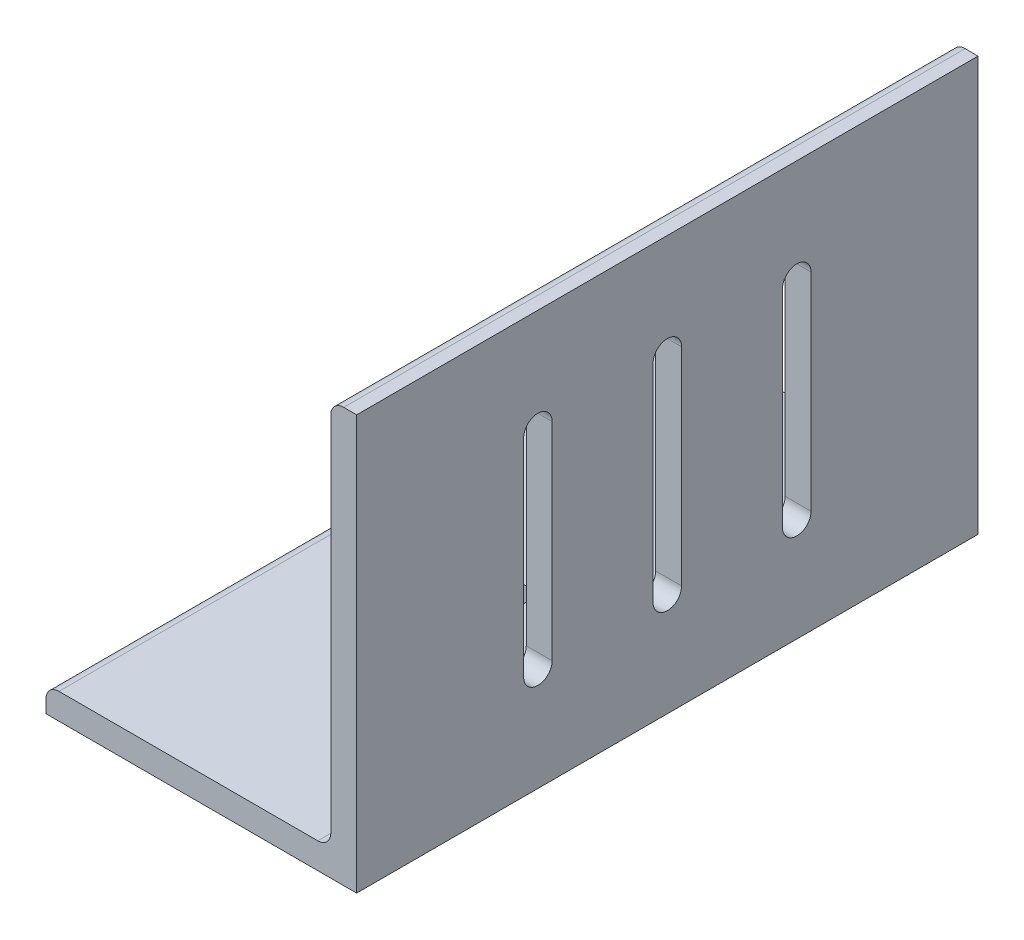
ISO-10303-21;
HEADER;
FILE_DESCRIPTION(('STEP AP214'),'2;1');
FILE_NAME('part.step','',(''),(''),'','','');
FILE_SCHEMA(('AUTOMOTIVE_DESIGN { 1 0 10303 214 1 1 1 1 }'));
ENDSEC;
DATA;
#1=APPLICATION_CONTEXT('core data for automotive mechanical design processes');
#2=APPLICATION_PROTOCOL_DEFINITION('international standard','automotive_design',2000,#1);
#3=PRODUCT_CONTEXT('',#1,'mechanical');
#4=PRODUCT('Part','Part','',(#3));
#5=PRODUCT_RELATED_PRODUCT_CATEGORY('part','',(#4));
#6=PRODUCT_DEFINITION_FORMATION('','',#4);
#7=PRODUCT_DEFINITION_CONTEXT('part definition',#1,'design');
#8=PRODUCT_DEFINITION('design','',#6,#7);
#9=PRODUCT_DEFINITION_SHAPE('','',#8);
#10=(LENGTH_UNIT() NAMED_UNIT(*) SI_UNIT(.MILLI.,.METRE.));
#11=(NAMED_UNIT(*) PLANE_ANGLE_UNIT() SI_UNIT($,.RADIAN.));
#12=(NAMED_UNIT(*) SI_UNIT($,.STERADIAN.) SOLID_ANGLE_UNIT());
#13=UNCERTAINTY_MEASURE_WITH_UNIT(LENGTH_MEASURE(1.E-05),#10,'distance_accuracy_value','');
#14=(GEOMETRIC_REPRESENTATION_CONTEXT(3) GLOBAL_UNCERTAINTY_ASSIGNED_CONTEXT((#13)) GLOBAL_UNIT_ASSIGNED_CONTEXT((#10,
#11,#12)) REPRESENTATION_CONTEXT('',''));
#15=CARTESIAN_POINT('',(0.,0.,0.));
#16=DIRECTION('',(0.,0.,1.));
#17=DIRECTION('',(1.,0.,0.));
#18=AXIS2_PLACEMENT_3D('',#15,#16,#17);
#19=CARTESIAN_POINT('',(-38.1,3.175,76.2));
#20=DIRECTION('',(1.,0.,0.));
#21=DIRECTION('',(0.,0.,-1.));
#22=AXIS2_PLACEMENT_3D('',#19,#20,#21);
#23=PLANE('',#22);
#24=DIRECTION('',(0.,-1.,0.));
#25=VECTOR('',#24,1.);
#26=CARTESIAN_POINT('',(-38.1,3.175,-76.2));
#27=LINE('',#26,#25);
#28=CARTESIAN_POINT('',(-38.1,3.175,-76.2));
#29=VERTEX_POINT('',#28);
#30=CARTESIAN_POINT('',(-38.1,0.,-76.2));
#31=VERTEX_POINT('',#30);
#32=EDGE_CURVE('E222',#29,#31,#27,.T.);
#33=ORIENTED_EDGE('',*,*,#32,.T.);
#34=DIRECTION('',(0.,0.,-1.));
#35=VECTOR('',#34,1.);
#36=CARTESIAN_POINT('',(-38.1,0.,76.2));
#37=LINE('',#36,#35);
#38=CARTESIAN_POINT('',(-38.1,0.,76.2));
#39=VERTEX_POINT('',#38);
#40=EDGE_CURVE('E368',#39,#31,#37,.T.);
#41=ORIENTED_EDGE('',*,*,#40,.F.);
#42=DIRECTION('',(0.,-1.,0.));
#43=VECTOR('',#42,1.);
#44=CARTESIAN_POINT('',(-38.1,3.175,76.2));
#45=LINE('',#44,#43);
#46=CARTESIAN_POINT('',(-38.1,3.175,76.2));
#47=VERTEX_POINT('',#46);
#48=EDGE_CURVE('E281',#47,#39,#45,.T.);
#49=ORIENTED_EDGE('',*,*,#48,.F.);
#50=DIRECTION('',(0.,0.,-1.));
#51=VECTOR('',#50,1.);
#52=CARTESIAN_POINT('',(-38.1,3.175,76.2));
#53=LINE('',#52,#51);
#54=EDGE_CURVE('E310',#47,#29,#53,.T.);
#55=ORIENTED_EDGE('',*,*,#54,.T.);
#56=EDGE_LOOP('',(#33,#41,#49,#55));
#57=FACE_BOUND('',#56,.T.);
#58=ADVANCED_FACE('F41',(#57),#23,.F.);
#59=CARTESIAN_POINT('',(-38.1,0.,76.2));
#60=DIRECTION('',(0.,1.,0.));
#61=DIRECTION('',(0.,0.,1.));
#62=AXIS2_PLACEMENT_3D('',#59,#60,#61);
#63=PLANE('',#62);
#64=CARTESIAN_POINT('',(2.67147415300428E-13,0.,-25.4));
#65=DIRECTION('',(0.,-1.,0.));
#66=DIRECTION('',(0.,0.,1.));
#67=AXIS2_PLACEMENT_3D('',#64,#65,#66);
#68=CIRCLE('',#67,3.5);
#69=CARTESIAN_POINT('',(2.67147415300428E-13,0.,-21.9));
#70=VERTEX_POINT('',#69);
#71=EDGE_CURVE('E567',#70,#70,#68,.T.);
#72=ORIENTED_EDGE('',*,*,#71,.F.);
#73=EDGE_LOOP('',(#72));
#74=FACE_BOUND('',#73,.T.);
#75=CARTESIAN_POINT('',(-2.67147415300428E-13,0.,25.4));
#76=DIRECTION('',(0.,-1.,0.));
#77=DIRECTION('',(0.,0.,-1.));
#78=AXIS2_PLACEMENT_3D('',#75,#76,#77);
#79=CIRCLE('',#78,3.5);
#80=CARTESIAN_POINT('',(-2.67147415300428E-13,0.,21.9));
#81=VERTEX_POINT('',#80);
#82=EDGE_CURVE('E563',#81,#81,#79,.T.);
#83=ORIENTED_EDGE('',*,*,#82,.F.);
#84=EDGE_LOOP('',(#83));
#85=FACE_BOUND('',#84,.T.);
#86=CARTESIAN_POINT('',(0.,0.,0.));
#87=DIRECTION('',(0.,-1.,0.));
#88=DIRECTION('',(0.,0.,-1.));
#89=AXIS2_PLACEMENT_3D('',#86,#87,#88);
#90=CIRCLE('',#89,3.5);
#91=CARTESIAN_POINT('',(0.,0.,-3.50000000000003));
#92=VERTEX_POINT('',#91);
#93=EDGE_CURVE('E416',#92,#92,#90,.T.);
#94=ORIENTED_EDGE('',*,*,#93,.F.);
#95=EDGE_LOOP('',(#94));
#96=FACE_BOUND('',#95,.T.);
#97=DIRECTION('',(1.,0.,0.));
#98=VECTOR('',#97,1.);
#99=CARTESIAN_POINT('',(-38.1,0.,-76.2));
#100=LINE('',#99,#98);
#101=CARTESIAN_POINT('',(38.1,0.,-76.2));
#102=VERTEX_POINT('',#101);
#103=EDGE_CURVE('E314',#31,#102,#100,.T.);
#104=ORIENTED_EDGE('',*,*,#103,.T.);
#105=DIRECTION('',(0.,0.,-1.));
#106=VECTOR('',#105,1.);
#107=CARTESIAN_POINT('',(38.1,0.,76.2));
#108=LINE('',#107,#106);
#109=CARTESIAN_POINT('',(38.1,0.,76.2));
#110=VERTEX_POINT('',#109);
#111=EDGE_CURVE('E364',#110,#102,#108,.T.);
#112=ORIENTED_EDGE('',*,*,#111,.F.);
#113=DIRECTION('',(1.,0.,0.));
#114=VECTOR('',#113,1.);
#115=CARTESIAN_POINT('',(-38.1,0.,76.2));
#116=LINE('',#115,#114);
#117=EDGE_CURVE('E285',#39,#110,#116,.T.);
#118=ORIENTED_EDGE('',*,*,#117,.F.);
#119=ORIENTED_EDGE('',*,*,#40,.T.);
#120=EDGE_LOOP('',(#104,#112,#118,#119));
#121=FACE_BOUND('',#120,.T.);
#122=ADVANCED_FACE('F441',(#74,#85,#96,#121),#63,.F.);
#123=CARTESIAN_POINT('',(38.1,0.,76.2));
#124=DIRECTION('',(-1.,0.,0.));
#125=DIRECTION('',(0.,-1.,0.));
#126=AXIS2_PLACEMENT_3D('',#123,#124,#125);
#127=PLANE('',#126);
#128=DIRECTION('',(0.,-1.,0.));
#129=VECTOR('',#128,1.);
#130=CARTESIAN_POINT('',(38.1,76.2,35.25));
#131=LINE('',#130,#129);
#132=CARTESIAN_POINT('',(38.1,76.2,35.25));
#133=VERTEX_POINT('',#132);
#134=CARTESIAN_POINT('',(38.1,25.4,35.25));
#135=VERTEX_POINT('',#134);
#136=EDGE_CURVE('E204',#133,#135,#131,.T.);
#137=ORIENTED_EDGE('',*,*,#136,.F.);
#138=CARTESIAN_POINT('',(38.1,76.2,31.75));
#139=DIRECTION('',(1.,0.,0.));
#140=DIRECTION('',(0.,1.,0.));
#141=AXIS2_PLACEMENT_3D('',#138,#139,#140);
#142=CIRCLE('',#141,3.5);
#143=CARTESIAN_POINT('',(38.1,76.2,28.25));
#144=VERTEX_POINT('',#143);
#145=EDGE_CURVE('E58',#144,#133,#142,.T.);
#146=ORIENTED_EDGE('',*,*,#145,.F.);
#147=DIRECTION('',(0.,1.,0.));
#148=VECTOR('',#147,1.);
#149=CARTESIAN_POINT('',(38.1,76.2,28.25));
#150=LINE('',#149,#148);
#151=CARTESIAN_POINT('',(38.1,25.4,28.25));
#152=VERTEX_POINT('',#151);
#153=EDGE_CURVE('E212',#152,#144,#150,.T.);
#154=ORIENTED_EDGE('',*,*,#153,.F.);
#155=CARTESIAN_POINT('',(38.1,25.4,31.75));
#156=DIRECTION('',(1.,0.,0.));
#157=DIRECTION('',(0.,1.,0.));
#158=AXIS2_PLACEMENT_3D('',#155,#156,#157);
#159=CIRCLE('',#158,3.5);
#160=EDGE_CURVE('E193',#135,#152,#159,.T.);
#161=ORIENTED_EDGE('',*,*,#160,.F.);
#162=EDGE_LOOP('',(#137,#146,#154,#161));
#163=FACE_BOUND('',#162,.T.);
#164=DIRECTION('',(0.,-1.,0.));
#165=VECTOR('',#164,1.);
#166=CARTESIAN_POINT('',(38.1,76.2,-28.25));
#167=LINE('',#166,#165);
#168=CARTESIAN_POINT('',(38.1,76.2,-28.25));
#169=VERTEX_POINT('',#168);
#170=CARTESIAN_POINT('',(38.1,25.4,-28.25));
#171=VERTEX_POINT('',#170);
#172=EDGE_CURVE('E229',#169,#171,#167,.T.);
#173=ORIENTED_EDGE('',*,*,#172,.F.);
#174=CARTESIAN_POINT('',(38.1,76.2,-31.75));
#175=DIRECTION('',(1.,0.,0.));
#176=DIRECTION('',(0.,-1.,0.));
#177=AXIS2_PLACEMENT_3D('',#174,#175,#176);
#178=CIRCLE('',#177,3.5);
#179=CARTESIAN_POINT('',(38.1,76.2,-35.25));
#180=VERTEX_POINT('',#179);
#181=EDGE_CURVE('E66',#180,#169,#178,.T.);
#182=ORIENTED_EDGE('',*,*,#181,.F.);
#183=DIRECTION('',(0.,1.,0.));
#184=VECTOR('',#183,1.);
#185=CARTESIAN_POINT('',(38.1,76.2,-35.25));
#186=LINE('',#185,#184);
#187=CARTESIAN_POINT('',(38.1,25.4,-35.25));
#188=VERTEX_POINT('',#187);
#189=EDGE_CURVE('E238',#188,#180,#186,.T.);
#190=ORIENTED_EDGE('',*,*,#189,.F.);
#191=CARTESIAN_POINT('',(38.1,25.4,-31.75));
#192=DIRECTION('',(1.,0.,0.));
#193=DIRECTION('',(0.,-1.,0.));
#194=AXIS2_PLACEMENT_3D('',#191,#192,#193);
#195=CIRCLE('',#194,3.5);
#196=EDGE_CURVE('E234',#171,#188,#195,.T.);
#197=ORIENTED_EDGE('',*,*,#196,.F.);
#198=EDGE_LOOP('',(#173,#182,#190,#197));
#199=FACE_BOUND('',#198,.T.);
#200=DIRECTION('',(0.,-1.,0.));
#201=VECTOR('',#200,1.);
#202=CARTESIAN_POINT('',(38.1,76.2,3.5));
#203=LINE('',#202,#201);
#204=CARTESIAN_POINT('',(38.1,76.2,3.50000000000001));
#205=VERTEX_POINT('',#204);
#206=CARTESIAN_POINT('',(38.1,25.4,3.50000000000001));
#207=VERTEX_POINT('',#206);
#208=EDGE_CURVE('E257',#205,#207,#203,.T.);
#209=ORIENTED_EDGE('',*,*,#208,.F.);
#210=CARTESIAN_POINT('',(38.1,76.2,0.));
#211=DIRECTION('',(1.,0.,0.));
#212=DIRECTION('',(0.,1.,0.));
#213=AXIS2_PLACEMENT_3D('',#210,#211,#212);
#214=CIRCLE('',#213,3.5);
#215=CARTESIAN_POINT('',(38.1,76.2,-3.5));
#216=VERTEX_POINT('',#215);
#217=EDGE_CURVE('E254',#216,#205,#214,.T.);
#218=ORIENTED_EDGE('',*,*,#217,.F.);
#219=DIRECTION('',(0.,1.,0.));
#220=VECTOR('',#219,1.);
#221=CARTESIAN_POINT('',(38.1,76.2,-3.5));
#222=LINE('',#221,#220);
#223=CARTESIAN_POINT('',(38.1,25.4,-3.5));
#224=VERTEX_POINT('',#223);
#225=EDGE_CURVE('E265',#224,#216,#222,.T.);
#226=ORIENTED_EDGE('',*,*,#225,.F.);
#227=CARTESIAN_POINT('',(38.1,25.4,0.));
#228=DIRECTION('',(1.,0.,0.));
#229=DIRECTION('',(0.,1.,0.));
#230=AXIS2_PLACEMENT_3D('',#227,#228,#229);
#231=CIRCLE('',#230,3.5);
#232=EDGE_CURVE('E261',#207,#224,#231,.T.);
#233=ORIENTED_EDGE('',*,*,#232,.F.);
#234=EDGE_LOOP('',(#209,#218,#226,#233));
#235=FACE_BOUND('',#234,.T.);
#236=DIRECTION('',(0.,1.,0.));
#237=VECTOR('',#236,1.);
#238=CARTESIAN_POINT('',(38.1,0.,-76.2));
#239=LINE('',#238,#237);
#240=CARTESIAN_POINT('',(38.1,101.6,-76.2));
#241=VERTEX_POINT('',#240);
#242=EDGE_CURVE('E317',#102,#241,#239,.T.);
#243=ORIENTED_EDGE('',*,*,#242,.T.);
#244=DIRECTION('',(0.,0.,-1.));
#245=VECTOR('',#244,1.);
#246=CARTESIAN_POINT('',(38.1,101.6,76.2));
#247=LINE('',#246,#245);
#248=CARTESIAN_POINT('',(38.1,101.6,76.2));
#249=VERTEX_POINT('',#248);
#250=EDGE_CURVE('E360',#249,#241,#247,.T.);
#251=ORIENTED_EDGE('',*,*,#250,.F.);
#252=DIRECTION('',(0.,1.,0.));
#253=VECTOR('',#252,1.);
#254=CARTESIAN_POINT('',(38.1,0.,76.2));
#255=LINE('',#254,#253);
#256=EDGE_CURVE('E289',#110,#249,#255,.T.);
#257=ORIENTED_EDGE('',*,*,#256,.F.);
#258=ORIENTED_EDGE('',*,*,#111,.T.);
#259=EDGE_LOOP('',(#243,#251,#257,#258));
#260=FACE_BOUND('',#259,.T.);
#261=ADVANCED_FACE('F209',(#163,#199,#235,#260),#127,.F.);
#262=CARTESIAN_POINT('',(34.925,101.6,76.2));
#263=DIRECTION('',(0.,-1.,0.));
#264=DIRECTION('',(1.,0.,0.));
#265=AXIS2_PLACEMENT_3D('',#262,#263,#264);
#266=PLANE('',#265);
#267=DIRECTION('',(-1.,0.,0.));
#268=VECTOR('',#267,1.);
#269=CARTESIAN_POINT('',(34.925,101.6,-76.2));
#270=LINE('',#269,#268);
#271=CARTESIAN_POINT('',(34.925,101.6,-76.2));
#272=VERTEX_POINT('',#271);
#273=EDGE_CURVE('E320',#241,#272,#270,.T.);
#274=ORIENTED_EDGE('',*,*,#273,.T.);
#275=DIRECTION('',(0.,0.,-1.));
#276=VECTOR('',#275,1.);
#277=CARTESIAN_POINT('',(34.925,101.6,76.2));
#278=LINE('',#277,#276);
#279=CARTESIAN_POINT('',(34.925,101.6,76.2));
#280=VERTEX_POINT('',#279);
#281=EDGE_CURVE('E356',#280,#272,#278,.T.);
#282=ORIENTED_EDGE('',*,*,#281,.F.);
#283=DIRECTION('',(-1.,0.,0.));
#284=VECTOR('',#283,1.);
#285=CARTESIAN_POINT('',(34.925,101.6,76.2));
#286=LINE('',#285,#284);
#287=EDGE_CURVE('E292',#249,#280,#286,.T.);
#288=ORIENTED_EDGE('',*,*,#287,.F.);
#289=ORIENTED_EDGE('',*,*,#250,.T.);
#290=EDGE_LOOP('',(#274,#282,#288,#289));
#291=FACE_BOUND('',#290,.T.);
#292=ADVANCED_FACE('F485',(#291),#266,.F.);
#293=CARTESIAN_POINT('',(34.925,98.425,76.2));
#294=DIRECTION('',(0.,0.,-1.));
#295=DIRECTION('',(-1.,0.,0.));
#296=AXIS2_PLACEMENT_3D('',#293,#294,#295);
#297=CYLINDRICAL_SURFACE('',#296,3.175);
#298=CARTESIAN_POINT('',(34.925,98.425,-76.2));
#299=DIRECTION('',(0.,0.,1.));
#300=DIRECTION('',(-1.,0.,0.));
#301=AXIS2_PLACEMENT_3D('',#298,#299,#300);
#302=CIRCLE('',#301,3.175);
#303=CARTESIAN_POINT('',(31.75,98.425,-76.2));
#304=VERTEX_POINT('',#303);
#305=EDGE_CURVE('E323',#272,#304,#302,.T.);
#306=ORIENTED_EDGE('',*,*,#305,.T.);
#307=DIRECTION('',(0.,0.,-1.));
#308=VECTOR('',#307,1.);
#309=CARTESIAN_POINT('',(31.75,98.425,76.2));
#310=LINE('',#309,#308);
#311=CARTESIAN_POINT('',(31.75,98.425,76.2));
#312=VERTEX_POINT('',#311);
#313=EDGE_CURVE('E352',#312,#304,#310,.T.);
#314=ORIENTED_EDGE('',*,*,#313,.F.);
#315=CARTESIAN_POINT('',(34.925,98.425,76.2));
#316=DIRECTION('',(0.,0.,1.));
#317=DIRECTION('',(-1.,0.,0.));
#318=AXIS2_PLACEMENT_3D('',#315,#316,#317);
#319=CIRCLE('',#318,3.175);
#320=EDGE_CURVE('E295',#280,#312,#319,.T.);
#321=ORIENTED_EDGE('',*,*,#320,.F.);
#322=ORIENTED_EDGE('',*,*,#281,.T.);
#323=EDGE_LOOP('',(#306,#314,#321,#322));
#324=FACE_BOUND('',#323,.T.);
#325=ADVANCED_FACE('F482',(#324),#297,.T.);
#326=CARTESIAN_POINT('',(31.75,98.425,76.2));
#327=DIRECTION('',(1.,0.,0.));
#328=DIRECTION('',(0.,1.,0.));
#329=AXIS2_PLACEMENT_3D('',#326,#327,#328);
#330=PLANE('',#329);
#331=DIRECTION('',(0.,1.,0.));
#332=VECTOR('',#331,1.);
#333=CARTESIAN_POINT('',(31.75,98.425,28.25));
#334=LINE('',#333,#332);
#335=CARTESIAN_POINT('',(31.75,25.4,28.25));
#336=VERTEX_POINT('',#335);
#337=CARTESIAN_POINT('',(31.75,76.2,28.25));
#338=VERTEX_POINT('',#337);
#339=EDGE_CURVE('E50',#336,#338,#334,.T.);
#340=ORIENTED_EDGE('',*,*,#339,.T.);
#341=CARTESIAN_POINT('',(31.75,76.2,31.75));
#342=DIRECTION('',(1.,0.,0.));
#343=DIRECTION('',(0.,1.,0.));
#344=AXIS2_PLACEMENT_3D('',#341,#342,#343);
#345=CIRCLE('',#344,3.5);
#346=CARTESIAN_POINT('',(31.75,76.2,35.25));
#347=VERTEX_POINT('',#346);
#348=EDGE_CURVE('E11',#338,#347,#345,.T.);
#349=ORIENTED_EDGE('',*,*,#348,.T.);
#350=DIRECTION('',(0.,-1.,0.));
#351=VECTOR('',#350,1.);
#352=CARTESIAN_POINT('',(31.75,98.425,35.25));
#353=LINE('',#352,#351);
#354=CARTESIAN_POINT('',(31.75,25.4,35.25));
#355=VERTEX_POINT('',#354);
#356=EDGE_CURVE('E404',#347,#355,#353,.T.);
#357=ORIENTED_EDGE('',*,*,#356,.T.);
#358=CARTESIAN_POINT('',(31.75,25.4,31.75));
#359=DIRECTION('',(1.,0.,0.));
#360=DIRECTION('',(0.,1.,0.));
#361=AXIS2_PLACEMENT_3D('',#358,#359,#360);
#362=CIRCLE('',#361,3.5);
#363=EDGE_CURVE('E196',#355,#336,#362,.T.);
#364=ORIENTED_EDGE('',*,*,#363,.T.);
#365=EDGE_LOOP('',(#340,#349,#357,#364));
#366=FACE_BOUND('',#365,.T.);
#367=DIRECTION('',(0.,1.,0.));
#368=VECTOR('',#367,1.);
#369=CARTESIAN_POINT('',(31.75,98.425,-35.25));
#370=LINE('',#369,#368);
#371=CARTESIAN_POINT('',(31.75,25.4,-35.25));
#372=VERTEX_POINT('',#371);
#373=CARTESIAN_POINT('',(31.75,76.2,-35.25));
#374=VERTEX_POINT('',#373);
#375=EDGE_CURVE('E396',#372,#374,#370,.T.);
#376=ORIENTED_EDGE('',*,*,#375,.T.);
#377=CARTESIAN_POINT('',(31.75,76.2,-31.75));
#378=DIRECTION('',(1.,0.,0.));
#379=DIRECTION('',(0.,1.,0.));
#380=AXIS2_PLACEMENT_3D('',#377,#378,#379);
#381=CIRCLE('',#380,3.5);
#382=CARTESIAN_POINT('',(31.75,76.2,-28.25));
#383=VERTEX_POINT('',#382);
#384=EDGE_CURVE('E400',#374,#383,#381,.T.);
#385=ORIENTED_EDGE('',*,*,#384,.T.);
#386=DIRECTION('',(0.,-1.,0.));
#387=VECTOR('',#386,1.);
#388=CARTESIAN_POINT('',(31.75,98.425,-28.25));
#389=LINE('',#388,#387);
#390=CARTESIAN_POINT('',(31.75,25.4,-28.25));
#391=VERTEX_POINT('',#390);
#392=EDGE_CURVE('E388',#383,#391,#389,.T.);
#393=ORIENTED_EDGE('',*,*,#392,.T.);
#394=CARTESIAN_POINT('',(31.75,25.4,-31.75));
#395=DIRECTION('',(1.,0.,0.));
#396=DIRECTION('',(0.,1.,0.));
#397=AXIS2_PLACEMENT_3D('',#394,#395,#396);
#398=CIRCLE('',#397,3.5);
#399=EDGE_CURVE('E392',#391,#372,#398,.T.);
#400=ORIENTED_EDGE('',*,*,#399,.T.);
#401=EDGE_LOOP('',(#376,#385,#393,#400));
#402=FACE_BOUND('',#401,.T.);
#403=DIRECTION('',(0.,1.,0.));
#404=VECTOR('',#403,1.);
#405=CARTESIAN_POINT('',(31.75,98.425,-3.5));
#406=LINE('',#405,#404);
#407=CARTESIAN_POINT('',(31.75,25.4,-3.5));
#408=VERTEX_POINT('',#407);
#409=CARTESIAN_POINT('',(31.75,76.2,-3.5));
#410=VERTEX_POINT('',#409);
#411=EDGE_CURVE('E380',#408,#410,#406,.T.);
#412=ORIENTED_EDGE('',*,*,#411,.T.);
#413=CARTESIAN_POINT('',(31.75,76.2,0.));
#414=DIRECTION('',(1.,0.,0.));
#415=DIRECTION('',(0.,1.,0.));
#416=AXIS2_PLACEMENT_3D('',#413,#414,#415);
#417=CIRCLE('',#416,3.5);
#418=CARTESIAN_POINT('',(31.75,76.2,3.5));
#419=VERTEX_POINT('',#418);
#420=EDGE_CURVE('E384',#410,#419,#417,.T.);
#421=ORIENTED_EDGE('',*,*,#420,.T.);
#422=DIRECTION('',(0.,-1.,0.));
#423=VECTOR('',#422,1.);
#424=CARTESIAN_POINT('',(31.75,98.425,3.5));
#425=LINE('',#424,#423);
#426=CARTESIAN_POINT('',(31.75,25.4,3.5));
#427=VERTEX_POINT('',#426);
#428=EDGE_CURVE('E372',#419,#427,#425,.T.);
#429=ORIENTED_EDGE('',*,*,#428,.T.);
#430=CARTESIAN_POINT('',(31.75,25.4,0.));
#431=DIRECTION('',(1.,0.,0.));
#432=DIRECTION('',(0.,1.,0.));
#433=AXIS2_PLACEMENT_3D('',#430,#431,#432);
#434=CIRCLE('',#433,3.5);
#435=EDGE_CURVE('E376',#427,#408,#434,.T.);
#436=ORIENTED_EDGE('',*,*,#435,.T.);
#437=EDGE_LOOP('',(#412,#421,#429,#436));
#438=FACE_BOUND('',#437,.T.);
#439=DIRECTION('',(0.,-1.,0.));
#440=VECTOR('',#439,1.);
#441=CARTESIAN_POINT('',(31.75,98.425,-76.2));
#442=LINE('',#441,#440);
#443=CARTESIAN_POINT('',(31.75,9.52499999999999,-76.2));
#444=VERTEX_POINT('',#443);
#445=EDGE_CURVE('E326',#304,#444,#442,.T.);
#446=ORIENTED_EDGE('',*,*,#445,.T.);
#447=DIRECTION('',(0.,0.,-1.));
#448=VECTOR('',#447,1.);
#449=CARTESIAN_POINT('',(31.75,9.52499999999999,76.2));
#450=LINE('',#449,#448);
#451=CARTESIAN_POINT('',(31.75,9.52499999999999,76.2));
#452=VERTEX_POINT('',#451);
#453=EDGE_CURVE('E348',#452,#444,#450,.T.);
#454=ORIENTED_EDGE('',*,*,#453,.F.);
#455=DIRECTION('',(0.,-1.,0.));
#456=VECTOR('',#455,1.);
#457=CARTESIAN_POINT('',(31.75,98.425,76.2));
#458=LINE('',#457,#456);
#459=EDGE_CURVE('E298',#312,#452,#458,.T.);
#460=ORIENTED_EDGE('',*,*,#459,.F.);
#461=ORIENTED_EDGE('',*,*,#313,.T.);
#462=EDGE_LOOP('',(#446,#454,#460,#461));
#463=FACE_BOUND('',#462,.T.);
#464=ADVANCED_FACE('F478',(#366,#402,#438,#463),#330,.F.);
#465=CARTESIAN_POINT('',(28.575,9.52499999999999,76.2));
#466=DIRECTION('',(0.,0.,-1.));
#467=DIRECTION('',(-1.,0.,0.));
#468=AXIS2_PLACEMENT_3D('',#465,#466,#467);
#469=CYLINDRICAL_SURFACE('',#468,3.175);
#470=CARTESIAN_POINT('',(28.575,9.52499999999999,-76.2));
#471=DIRECTION('',(0.,0.,-1.));
#472=DIRECTION('',(-1.,0.,0.));
#473=AXIS2_PLACEMENT_3D('',#470,#471,#472);
#474=CIRCLE('',#473,3.175);
#475=CARTESIAN_POINT('',(28.575,6.35,-76.2));
#476=VERTEX_POINT('',#475);
#477=EDGE_CURVE('E329',#444,#476,#474,.T.);
#478=ORIENTED_EDGE('',*,*,#477,.T.);
#479=DIRECTION('',(0.,0.,-1.));
#480=VECTOR('',#479,1.);
#481=CARTESIAN_POINT('',(28.575,6.35,76.2));
#482=LINE('',#481,#480);
#483=CARTESIAN_POINT('',(28.575,6.35,76.2));
#484=VERTEX_POINT('',#483);
#485=EDGE_CURVE('E344',#484,#476,#482,.T.);
#486=ORIENTED_EDGE('',*,*,#485,.F.);
#487=CARTESIAN_POINT('',(28.575,9.52499999999999,76.2));
#488=DIRECTION('',(0.,0.,-1.));
#489=DIRECTION('',(-1.,0.,0.));
#490=AXIS2_PLACEMENT_3D('',#487,#488,#489);
#491=CIRCLE('',#490,3.175);
#492=EDGE_CURVE('E301',#452,#484,#491,.T.);
#493=ORIENTED_EDGE('',*,*,#492,.F.);
#494=ORIENTED_EDGE('',*,*,#453,.T.);
#495=EDGE_LOOP('',(#478,#486,#493,#494));
#496=FACE_BOUND('',#495,.T.);
#497=ADVANCED_FACE('F473',(#496),#469,.F.);
#498=CARTESIAN_POINT('',(28.575,6.35,76.2));
#499=DIRECTION('',(0.,-1.,0.));
#500=DIRECTION('',(1.,0.,0.));
#501=AXIS2_PLACEMENT_3D('',#498,#499,#500);
#502=PLANE('',#501);
#503=CARTESIAN_POINT('',(2.67147415300428E-13,6.35,-25.4));
#504=DIRECTION('',(0.,-1.,0.));
#505=DIRECTION('',(1.,0.,0.));
#506=AXIS2_PLACEMENT_3D('',#503,#504,#505);
#507=CIRCLE('',#506,3.5);
#508=CARTESIAN_POINT('',(3.50000000000027,6.35,-25.4));
#509=VERTEX_POINT('',#508);
#510=EDGE_CURVE('E44',#509,#509,#507,.T.);
#511=ORIENTED_EDGE('',*,*,#510,.T.);
#512=EDGE_LOOP('',(#511));
#513=FACE_BOUND('',#512,.T.);
#514=CARTESIAN_POINT('',(-2.67147415300428E-13,6.35,25.4));
#515=DIRECTION('',(0.,-1.,0.));
#516=DIRECTION('',(1.,0.,0.));
#517=AXIS2_PLACEMENT_3D('',#514,#515,#516);
#518=CIRCLE('',#517,3.5);
#519=CARTESIAN_POINT('',(3.49999999999973,6.35,25.4));
#520=VERTEX_POINT('',#519);
#521=EDGE_CURVE('E415',#520,#520,#518,.T.);
#522=ORIENTED_EDGE('',*,*,#521,.T.);
#523=EDGE_LOOP('',(#522));
#524=FACE_BOUND('',#523,.T.);
#525=CARTESIAN_POINT('',(0.,6.35,0.));
#526=DIRECTION('',(0.,-1.,0.));
#527=DIRECTION('',(1.,0.,0.));
#528=AXIS2_PLACEMENT_3D('',#525,#526,#527);
#529=CIRCLE('',#528,3.5);
#530=CARTESIAN_POINT('',(3.5,6.35,0.));
#531=VERTEX_POINT('',#530);
#532=EDGE_CURVE('E412',#531,#531,#529,.T.);
#533=ORIENTED_EDGE('',*,*,#532,.T.);
#534=EDGE_LOOP('',(#533));
#535=FACE_BOUND('',#534,.T.);
#536=DIRECTION('',(-1.,0.,0.));
#537=VECTOR('',#536,1.);
#538=CARTESIAN_POINT('',(28.575,6.35,-76.2));
#539=LINE('',#538,#537);
#540=CARTESIAN_POINT('',(-34.925,6.34999999999999,-76.2));
#541=VERTEX_POINT('',#540);
#542=EDGE_CURVE('E332',#476,#541,#539,.T.);
#543=ORIENTED_EDGE('',*,*,#542,.T.);
#544=DIRECTION('',(0.,0.,-1.));
#545=VECTOR('',#544,1.);
#546=CARTESIAN_POINT('',(-34.925,6.34999999999999,76.2));
#547=LINE('',#546,#545);
#548=CARTESIAN_POINT('',(-34.925,6.34999999999999,76.2));
#549=VERTEX_POINT('',#548);
#550=EDGE_CURVE('E340',#549,#541,#547,.T.);
#551=ORIENTED_EDGE('',*,*,#550,.F.);
#552=DIRECTION('',(-1.,0.,0.));
#553=VECTOR('',#552,1.);
#554=CARTESIAN_POINT('',(28.575,6.35,76.2));
#555=LINE('',#554,#553);
#556=EDGE_CURVE('E304',#484,#549,#555,.T.);
#557=ORIENTED_EDGE('',*,*,#556,.F.);
#558=ORIENTED_EDGE('',*,*,#485,.T.);
#559=EDGE_LOOP('',(#543,#551,#557,#558));
#560=FACE_BOUND('',#559,.T.);
#561=ADVANCED_FACE('F425',(#513,#524,#535,#560),#502,.F.);
#562=CARTESIAN_POINT('',(-34.925,3.175,76.2));
#563=DIRECTION('',(0.,0.,-1.));
#564=DIRECTION('',(-1.,0.,0.));
#565=AXIS2_PLACEMENT_3D('',#562,#563,#564);
#566=CYLINDRICAL_SURFACE('',#565,3.175);
#567=CARTESIAN_POINT('',(-34.925,3.175,-76.2));
#568=DIRECTION('',(0.,0.,1.));
#569=DIRECTION('',(-1.,0.,0.));
#570=AXIS2_PLACEMENT_3D('',#567,#568,#569);
#571=CIRCLE('',#570,3.175);
#572=EDGE_CURVE('E286',#541,#29,#571,.T.);
#573=ORIENTED_EDGE('',*,*,#572,.T.);
#574=ORIENTED_EDGE('',*,*,#54,.F.);
#575=CARTESIAN_POINT('',(-34.925,3.175,76.2));
#576=DIRECTION('',(0.,0.,1.));
#577=DIRECTION('',(-1.,0.,0.));
#578=AXIS2_PLACEMENT_3D('',#575,#576,#577);
#579=CIRCLE('',#578,3.175);
#580=EDGE_CURVE('E307',#549,#47,#579,.T.);
#581=ORIENTED_EDGE('',*,*,#580,.F.);
#582=ORIENTED_EDGE('',*,*,#550,.T.);
#583=EDGE_LOOP('',(#573,#574,#581,#582));
#584=FACE_BOUND('',#583,.T.);
#585=ADVANCED_FACE('F466',(#584),#566,.T.);
#586=CARTESIAN_POINT('',(34.925,98.425,76.2));
#587=DIRECTION('',(0.,0.,-1.));
#588=DIRECTION('',(-1.,0.,0.));
#589=AXIS2_PLACEMENT_3D('',#586,#587,#588);
#590=PLANE('',#589);
#591=ORIENTED_EDGE('',*,*,#48,.T.);
#592=ORIENTED_EDGE('',*,*,#117,.T.);
#593=ORIENTED_EDGE('',*,*,#256,.T.);
#594=ORIENTED_EDGE('',*,*,#287,.T.);
#595=ORIENTED_EDGE('',*,*,#320,.T.);
#596=ORIENTED_EDGE('',*,*,#459,.T.);
#597=ORIENTED_EDGE('',*,*,#492,.T.);
#598=ORIENTED_EDGE('',*,*,#556,.T.);
#599=ORIENTED_EDGE('',*,*,#580,.T.);
#600=EDGE_LOOP('',(#591,#592,#593,#594,#595,#596,#597,#598,#599));
#601=FACE_BOUND('',#600,.T.);
#602=ADVANCED_FACE('F461',(#601),#590,.F.);
#603=CARTESIAN_POINT('',(34.925,98.425,-76.2));
#604=DIRECTION('',(0.,0.,-1.));
#605=DIRECTION('',(-1.,0.,0.));
#606=AXIS2_PLACEMENT_3D('',#603,#604,#605);
#607=PLANE('',#606);
#608=ORIENTED_EDGE('',*,*,#32,.F.);
#609=ORIENTED_EDGE('',*,*,#572,.F.);
#610=ORIENTED_EDGE('',*,*,#542,.F.);
#611=ORIENTED_EDGE('',*,*,#477,.F.);
#612=ORIENTED_EDGE('',*,*,#445,.F.);
#613=ORIENTED_EDGE('',*,*,#305,.F.);
#614=ORIENTED_EDGE('',*,*,#273,.F.);
#615=ORIENTED_EDGE('',*,*,#242,.F.);
#616=ORIENTED_EDGE('',*,*,#103,.F.);
#617=EDGE_LOOP('',(#608,#609,#610,#611,#612,#613,#614,#615,#616));
#618=FACE_BOUND('',#617,.T.);
#619=ADVANCED_FACE('F453',(#618),#607,.T.);
#620=CARTESIAN_POINT('',(28.1,76.2,0.));
#621=DIRECTION('',(1.,0.,0.));
#622=DIRECTION('',(0.,1.,0.));
#623=AXIS2_PLACEMENT_3D('',#620,#621,#622);
#624=CYLINDRICAL_SURFACE('',#623,3.5);
#625=DIRECTION('',(1.,0.,0.));
#626=VECTOR('',#625,1.);
#627=CARTESIAN_POINT('',(28.1,76.2,-3.5));
#628=LINE('',#627,#626);
#629=EDGE_CURVE('E230',#410,#216,#628,.T.);
#630=ORIENTED_EDGE('',*,*,#629,.T.);
#631=ORIENTED_EDGE('',*,*,#217,.T.);
#632=DIRECTION('',(1.,0.,0.));
#633=VECTOR('',#632,1.);
#634=CARTESIAN_POINT('',(28.1,76.2,3.5));
#635=LINE('',#634,#633);
#636=EDGE_CURVE('E269',#419,#205,#635,.T.);
#637=ORIENTED_EDGE('',*,*,#636,.F.);
#638=ORIENTED_EDGE('',*,*,#420,.F.);
#639=EDGE_LOOP('',(#630,#631,#637,#638));
#640=FACE_BOUND('',#639,.T.);
#641=ADVANCED_FACE('F509',(#640),#624,.F.);
#642=CARTESIAN_POINT('',(28.1,76.2,-3.5));
#643=DIRECTION('',(0.,0.,-1.));
#644=DIRECTION('',(0.,1.,0.));
#645=AXIS2_PLACEMENT_3D('',#642,#643,#644);
#646=PLANE('',#645);
#647=DIRECTION('',(1.,0.,0.));
#648=VECTOR('',#647,1.);
#649=CARTESIAN_POINT('',(28.1,25.4,-3.5));
#650=LINE('',#649,#648);
#651=EDGE_CURVE('E272',#408,#224,#650,.T.);
#652=ORIENTED_EDGE('',*,*,#651,.T.);
#653=ORIENTED_EDGE('',*,*,#225,.T.);
#654=ORIENTED_EDGE('',*,*,#629,.F.);
#655=ORIENTED_EDGE('',*,*,#411,.F.);
#656=EDGE_LOOP('',(#652,#653,#654,#655));
#657=FACE_BOUND('',#656,.T.);
#658=ADVANCED_FACE('F514',(#657),#646,.F.);
#659=CARTESIAN_POINT('',(28.1,25.4,0.));
#660=DIRECTION('',(1.,0.,0.));
#661=DIRECTION('',(0.,1.,0.));
#662=AXIS2_PLACEMENT_3D('',#659,#660,#661);
#663=CYLINDRICAL_SURFACE('',#662,3.5);
#664=DIRECTION('',(1.,0.,0.));
#665=VECTOR('',#664,1.);
#666=CARTESIAN_POINT('',(28.1,25.4,3.50000000000001));
#667=LINE('',#666,#665);
#668=EDGE_CURVE('E275',#427,#207,#667,.T.);
#669=ORIENTED_EDGE('',*,*,#668,.T.);
#670=ORIENTED_EDGE('',*,*,#232,.T.);
#671=ORIENTED_EDGE('',*,*,#651,.F.);
#672=ORIENTED_EDGE('',*,*,#435,.F.);
#673=EDGE_LOOP('',(#669,#670,#671,#672));
#674=FACE_BOUND('',#673,.T.);
#675=ADVANCED_FACE('F520',(#674),#663,.F.);
#676=CARTESIAN_POINT('',(28.1,76.2,3.5));
#677=DIRECTION('',(0.,0.,1.));
#678=DIRECTION('',(0.,-1.,0.));
#679=AXIS2_PLACEMENT_3D('',#676,#677,#678);
#680=PLANE('',#679);
#681=ORIENTED_EDGE('',*,*,#636,.T.);
#682=ORIENTED_EDGE('',*,*,#208,.T.);
#683=ORIENTED_EDGE('',*,*,#668,.F.);
#684=ORIENTED_EDGE('',*,*,#428,.F.);
#685=EDGE_LOOP('',(#681,#682,#683,#684));
#686=FACE_BOUND('',#685,.T.);
#687=ADVANCED_FACE('F516',(#686),#680,.F.);
#688=CARTESIAN_POINT('',(28.1,76.2,-31.75));
#689=DIRECTION('',(1.,0.,0.));
#690=DIRECTION('',(0.,1.,0.));
#691=AXIS2_PLACEMENT_3D('',#688,#689,#690);
#692=CYLINDRICAL_SURFACE('',#691,3.5);
#693=DIRECTION('',(1.,0.,0.));
#694=VECTOR('',#693,1.);
#695=CARTESIAN_POINT('',(28.1,76.2,-35.25));
#696=LINE('',#695,#694);
#697=EDGE_CURVE('E243',#374,#180,#696,.T.);
#698=ORIENTED_EDGE('',*,*,#697,.T.);
#699=ORIENTED_EDGE('',*,*,#181,.T.);
#700=DIRECTION('',(1.,0.,0.));
#701=VECTOR('',#700,1.);
#702=CARTESIAN_POINT('',(28.1,76.2,-28.25));
#703=LINE('',#702,#701);
#704=EDGE_CURVE('E242',#383,#169,#703,.T.);
#705=ORIENTED_EDGE('',*,*,#704,.F.);
#706=ORIENTED_EDGE('',*,*,#384,.F.);
#707=EDGE_LOOP('',(#698,#699,#705,#706));
#708=FACE_BOUND('',#707,.T.);
#709=ADVANCED_FACE('F519',(#708),#692,.F.);
#710=CARTESIAN_POINT('',(28.1,76.2,-35.25));
#711=DIRECTION('',(0.,0.,-1.));
#712=DIRECTION('',(-1.,0.,0.));
#713=AXIS2_PLACEMENT_3D('',#710,#711,#712);
#714=PLANE('',#713);
#715=DIRECTION('',(1.,0.,0.));
#716=VECTOR('',#715,1.);
#717=CARTESIAN_POINT('',(28.1,25.4,-35.25));
#718=LINE('',#717,#716);
#719=EDGE_CURVE('E246',#372,#188,#718,.T.);
#720=ORIENTED_EDGE('',*,*,#719,.T.);
#721=ORIENTED_EDGE('',*,*,#189,.T.);
#722=ORIENTED_EDGE('',*,*,#697,.F.);
#723=ORIENTED_EDGE('',*,*,#375,.F.);
#724=EDGE_LOOP('',(#720,#721,#722,#723));
#725=FACE_BOUND('',#724,.T.);
#726=ADVANCED_FACE('F530',(#725),#714,.F.);
#727=CARTESIAN_POINT('',(28.1,25.4,-31.75));
#728=DIRECTION('',(1.,0.,0.));
#729=DIRECTION('',(0.,1.,0.));
#730=AXIS2_PLACEMENT_3D('',#727,#728,#729);
#731=CYLINDRICAL_SURFACE('',#730,3.5);
#732=DIRECTION('',(1.,0.,0.));
#733=VECTOR('',#732,1.);
#734=CARTESIAN_POINT('',(28.1,25.4,-28.25));
#735=LINE('',#734,#733);
#736=EDGE_CURVE('E249',#391,#171,#735,.T.);
#737=ORIENTED_EDGE('',*,*,#736,.T.);
#738=ORIENTED_EDGE('',*,*,#196,.T.);
#739=ORIENTED_EDGE('',*,*,#719,.F.);
#740=ORIENTED_EDGE('',*,*,#399,.F.);
#741=EDGE_LOOP('',(#737,#738,#739,#740));
#742=FACE_BOUND('',#741,.T.);
#743=ADVANCED_FACE('F535',(#742),#731,.F.);
#744=CARTESIAN_POINT('',(28.1,76.2,-28.25));
#745=DIRECTION('',(0.,0.,1.));
#746=DIRECTION('',(1.,0.,0.));
#747=AXIS2_PLACEMENT_3D('',#744,#745,#746);
#748=PLANE('',#747);
#749=ORIENTED_EDGE('',*,*,#704,.T.);
#750=ORIENTED_EDGE('',*,*,#172,.T.);
#751=ORIENTED_EDGE('',*,*,#736,.F.);
#752=ORIENTED_EDGE('',*,*,#392,.F.);
#753=EDGE_LOOP('',(#749,#750,#751,#752));
#754=FACE_BOUND('',#753,.T.);
#755=ADVANCED_FACE('F531',(#754),#748,.F.);
#756=CARTESIAN_POINT('',(28.1,76.2,31.75));
#757=DIRECTION('',(1.,0.,0.));
#758=DIRECTION('',(0.,1.,0.));
#759=AXIS2_PLACEMENT_3D('',#756,#757,#758);
#760=CYLINDRICAL_SURFACE('',#759,3.5);
#761=DIRECTION('',(1.,0.,0.));
#762=VECTOR('',#761,1.);
#763=CARTESIAN_POINT('',(28.1,76.2,28.25));
#764=LINE('',#763,#762);
#765=EDGE_CURVE('E219',#338,#144,#764,.T.);
#766=ORIENTED_EDGE('',*,*,#765,.T.);
#767=ORIENTED_EDGE('',*,*,#145,.T.);
#768=DIRECTION('',(1.,0.,0.));
#769=VECTOR('',#768,1.);
#770=CARTESIAN_POINT('',(28.1,76.2,35.25));
#771=LINE('',#770,#769);
#772=EDGE_CURVE('E201',#347,#133,#771,.T.);
#773=ORIENTED_EDGE('',*,*,#772,.F.);
#774=ORIENTED_EDGE('',*,*,#348,.F.);
#775=EDGE_LOOP('',(#766,#767,#773,#774));
#776=FACE_BOUND('',#775,.T.);
#777=ADVANCED_FACE('F534',(#776),#760,.F.);
#778=CARTESIAN_POINT('',(28.1,76.2,28.25));
#779=DIRECTION('',(0.,0.,-1.));
#780=DIRECTION('',(-1.,0.,0.));
#781=AXIS2_PLACEMENT_3D('',#778,#779,#780);
#782=PLANE('',#781);
#783=DIRECTION('',(1.,0.,0.));
#784=VECTOR('',#783,1.);
#785=CARTESIAN_POINT('',(28.1,25.4,28.25));
#786=LINE('',#785,#784);
#787=EDGE_CURVE('E200',#336,#152,#786,.T.);
#788=ORIENTED_EDGE('',*,*,#787,.T.);
#789=ORIENTED_EDGE('',*,*,#153,.T.);
#790=ORIENTED_EDGE('',*,*,#765,.F.);
#791=ORIENTED_EDGE('',*,*,#339,.F.);
#792=EDGE_LOOP('',(#788,#789,#790,#791));
#793=FACE_BOUND('',#792,.T.);
#794=ADVANCED_FACE('F545',(#793),#782,.F.);
#795=CARTESIAN_POINT('',(28.1,25.4,31.75));
#796=DIRECTION('',(1.,0.,0.));
#797=DIRECTION('',(0.,1.,0.));
#798=AXIS2_PLACEMENT_3D('',#795,#796,#797);
#799=CYLINDRICAL_SURFACE('',#798,3.5);
#800=DIRECTION('',(1.,0.,0.));
#801=VECTOR('',#800,1.);
#802=CARTESIAN_POINT('',(28.1,25.4,35.25));
#803=LINE('',#802,#801);
#804=EDGE_CURVE('E188',#355,#135,#803,.T.);
#805=ORIENTED_EDGE('',*,*,#804,.T.);
#806=ORIENTED_EDGE('',*,*,#160,.T.);
#807=ORIENTED_EDGE('',*,*,#787,.F.);
#808=ORIENTED_EDGE('',*,*,#363,.F.);
#809=EDGE_LOOP('',(#805,#806,#807,#808));
#810=FACE_BOUND('',#809,.T.);
#811=ADVANCED_FACE('F190',(#810),#799,.F.);
#812=CARTESIAN_POINT('',(28.1,76.2,35.25));
#813=DIRECTION('',(0.,0.,1.));
#814=DIRECTION('',(1.,0.,0.));
#815=AXIS2_PLACEMENT_3D('',#812,#813,#814);
#816=PLANE('',#815);
#817=ORIENTED_EDGE('',*,*,#772,.T.);
#818=ORIENTED_EDGE('',*,*,#136,.T.);
#819=ORIENTED_EDGE('',*,*,#804,.F.);
#820=ORIENTED_EDGE('',*,*,#356,.F.);
#821=EDGE_LOOP('',(#817,#818,#819,#820));
#822=FACE_BOUND('',#821,.T.);
#823=ADVANCED_FACE('F205',(#822),#816,.F.);
#824=CARTESIAN_POINT('',(0.,10.,0.));
#825=DIRECTION('',(0.,-1.,0.));
#826=DIRECTION('',(0.,0.,-1.));
#827=AXIS2_PLACEMENT_3D('',#824,#825,#826);
#828=CYLINDRICAL_SURFACE('',#827,3.5);
#829=ORIENTED_EDGE('',*,*,#93,.T.);
#830=EDGE_LOOP('',(#829));
#831=FACE_BOUND('',#830,.T.);
#832=ORIENTED_EDGE('',*,*,#532,.F.);
#833=EDGE_LOOP('',(#832));
#834=FACE_BOUND('',#833,.T.);
#835=ADVANCED_FACE('F435',(#831,#834),#828,.F.);
#836=CARTESIAN_POINT('',(-2.67147415300428E-13,10.,25.4));
#837=DIRECTION('',(0.,-1.,0.));
#838=DIRECTION('',(0.,0.,-1.));
#839=AXIS2_PLACEMENT_3D('',#836,#837,#838);
#840=CYLINDRICAL_SURFACE('',#839,3.5);
#841=ORIENTED_EDGE('',*,*,#82,.T.);
#842=EDGE_LOOP('',(#841));
#843=FACE_BOUND('',#842,.T.);
#844=ORIENTED_EDGE('',*,*,#521,.F.);
#845=EDGE_LOOP('',(#844));
#846=FACE_BOUND('',#845,.T.);
#847=ADVANCED_FACE('F429',(#843,#846),#840,.F.);
#848=CARTESIAN_POINT('',(2.67147415300428E-13,10.,-25.4));
#849=DIRECTION('',(0.,-1.,0.));
#850=DIRECTION('',(0.,0.,-1.));
#851=AXIS2_PLACEMENT_3D('',#848,#849,#850);
#852=CYLINDRICAL_SURFACE('',#851,3.5);
#853=ORIENTED_EDGE('',*,*,#71,.T.);
#854=EDGE_LOOP('',(#853));
#855=FACE_BOUND('',#854,.T.);
#856=ORIENTED_EDGE('',*,*,#510,.F.);
#857=EDGE_LOOP('',(#856));
#858=FACE_BOUND('',#857,.T.);
#859=ADVANCED_FACE('F427',(#855,#858),#852,.F.);
#860=CLOSED_SHELL('',(#58,#122,#261,#292,#325,#464,#497,#561,#585,#602,#619,#641,#658,#675,#687,
#709,#726,#743,#755,#777,#794,#811,#823,#835,#847,#859));
#861=MANIFOLD_SOLID_BREP('B2',#860);
#862=ADVANCED_BREP_SHAPE_REPRESENTATION('',(#18,#861),#14);
#863=SHAPE_DEFINITION_REPRESENTATION(#9,#862);
ENDSEC;
END-ISO-10303-21;
